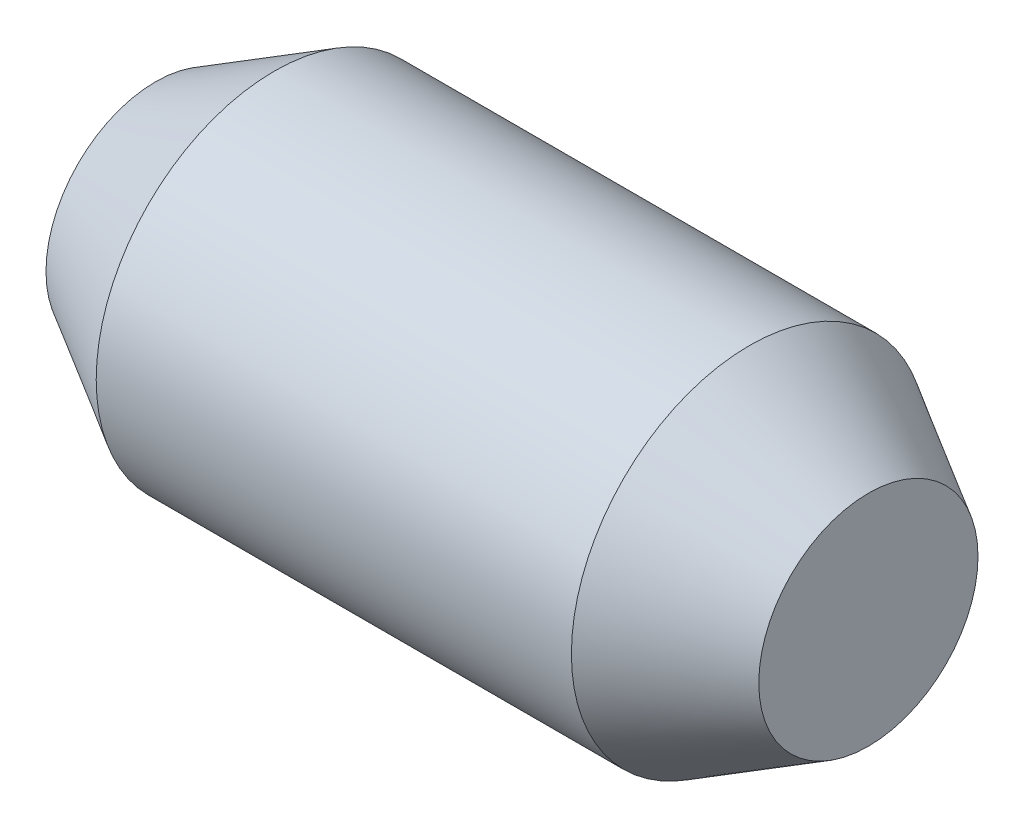
ISO-10303-21;
HEADER;
FILE_DESCRIPTION(('STEP AP214'),'2;1');
FILE_NAME('part.step','',(''),(''),'','','');
FILE_SCHEMA(('AUTOMOTIVE_DESIGN { 1 0 10303 214 1 1 1 1 }'));
ENDSEC;
DATA;
#1=APPLICATION_CONTEXT('core data for automotive mechanical design processes');
#2=APPLICATION_PROTOCOL_DEFINITION('international standard','automotive_design',2000,#1);
#3=PRODUCT_CONTEXT('',#1,'mechanical');
#4=PRODUCT('Part','Part','',(#3));
#5=PRODUCT_RELATED_PRODUCT_CATEGORY('part','',(#4));
#6=PRODUCT_DEFINITION_FORMATION('','',#4);
#7=PRODUCT_DEFINITION_CONTEXT('part definition',#1,'design');
#8=PRODUCT_DEFINITION('design','',#6,#7);
#9=PRODUCT_DEFINITION_SHAPE('','',#8);
#10=(LENGTH_UNIT() NAMED_UNIT(*) SI_UNIT(.MILLI.,.METRE.));
#11=(NAMED_UNIT(*) PLANE_ANGLE_UNIT() SI_UNIT($,.RADIAN.));
#12=(NAMED_UNIT(*) SI_UNIT($,.STERADIAN.) SOLID_ANGLE_UNIT());
#13=UNCERTAINTY_MEASURE_WITH_UNIT(LENGTH_MEASURE(1.E-05),#10,'distance_accuracy_value','');
#14=(GEOMETRIC_REPRESENTATION_CONTEXT(3) GLOBAL_UNCERTAINTY_ASSIGNED_CONTEXT((#13)) GLOBAL_UNIT_ASSIGNED_CONTEXT((#10,
#11,#12)) REPRESENTATION_CONTEXT('',''));
#15=CARTESIAN_POINT('',(0.,0.,0.));
#16=DIRECTION('',(0.,0.,1.));
#17=DIRECTION('',(1.,0.,0.));
#18=AXIS2_PLACEMENT_3D('',#15,#16,#17);
#19=CARTESIAN_POINT('',(6.,0.461324865405117,0.));
#20=DIRECTION('',(1.,0.,0.));
#21=DIRECTION('',(0.,0.,-1.));
#22=AXIS2_PLACEMENT_3D('',#19,#20,#21);
#23=PLANE('',#22);
#24=CARTESIAN_POINT('',(6.00000000019918,0.,0.));
#25=DIRECTION('',(-1.,0.,0.));
#26=DIRECTION('',(0.,0.,1.));
#27=AXIS2_PLACEMENT_3D('',#24,#25,#26);
#28=CIRCLE('',#27,0.922649731080611);
#29=CARTESIAN_POINT('',(6.00000000019918,0.,0.922649731080611));
#30=VERTEX_POINT('',#29);
#31=EDGE_CURVE('E18',#30,#30,#28,.T.);
#32=ORIENTED_EDGE('',*,*,#31,.F.);
#33=EDGE_LOOP('',(#32));
#34=FACE_BOUND('',#33,.T.);
#35=ADVANCED_FACE('F14',(#34),#23,.T.);
#36=CARTESIAN_POINT('',(0.,0.461324865405168,0.));
#37=DIRECTION('',(-1.,0.,0.));
#38=DIRECTION('',(0.,0.,1.));
#39=AXIS2_PLACEMENT_3D('',#36,#37,#38);
#40=PLANE('',#39);
#41=CARTESIAN_POINT('',(-1.13686837721616E-10,0.,0.));
#42=DIRECTION('',(1.,0.,0.));
#43=DIRECTION('',(0.,0.,-1.));
#44=AXIS2_PLACEMENT_3D('',#41,#42,#43);
#45=CIRCLE('',#44,0.922649731155042);
#46=CARTESIAN_POINT('',(-1.13686837721616E-10,0.,-0.922649731155042));
#47=VERTEX_POINT('',#46);
#48=EDGE_CURVE('E27',#47,#47,#45,.T.);
#49=ORIENTED_EDGE('',*,*,#48,.F.);
#50=EDGE_LOOP('',(#49));
#51=FACE_BOUND('',#50,.T.);
#52=ADVANCED_FACE('F39',(#51),#40,.T.);
#53=CARTESIAN_POINT('',(4.99999999976808,0.,0.));
#54=DIRECTION('',(-1.,0.,0.));
#55=DIRECTION('',(0.,0.,1.));
#56=AXIS2_PLACEMENT_3D('',#53,#54,#55);
#57=CONICAL_SURFACE('',#56,1.49999999968034,0.523598774969205);
#58=ORIENTED_EDGE('',*,*,#31,.T.);
#59=EDGE_LOOP('',(#58));
#60=FACE_BOUND('',#59,.T.);
#61=CARTESIAN_POINT('',(4.99999999999999,0.,0.));
#62=DIRECTION('',(-1.,0.,0.));
#63=DIRECTION('',(0.,1.,0.));
#64=AXIS2_PLACEMENT_3D('',#61,#62,#63);
#65=CIRCLE('',#64,1.49999999999999);
#66=CARTESIAN_POINT('',(4.99999999999999,1.49999999999997,0.));
#67=VERTEX_POINT('',#66);
#68=EDGE_CURVE('E22',#67,#67,#65,.T.);
#69=ORIENTED_EDGE('',*,*,#68,.F.);
#70=EDGE_LOOP('',(#69));
#71=FACE_BOUND('',#70,.T.);
#72=ADVANCED_FACE('F35',(#60,#71),#57,.T.);
#73=CARTESIAN_POINT('',(0.999999999976353,0.,0.));
#74=DIRECTION('',(1.,0.,0.));
#75=DIRECTION('',(0.,0.,-1.));
#76=AXIS2_PLACEMENT_3D('',#73,#74,#75);
#77=CONICAL_SURFACE('',#76,1.4999999996235,0.523598775018433);
#78=ORIENTED_EDGE('',*,*,#48,.T.);
#79=EDGE_LOOP('',(#78));
#80=FACE_BOUND('',#79,.T.);
#81=CARTESIAN_POINT('',(0.999999999999988,0.,0.));
#82=DIRECTION('',(-1.,0.,0.));
#83=DIRECTION('',(0.,1.,0.));
#84=AXIS2_PLACEMENT_3D('',#81,#82,#83);
#85=CIRCLE('',#84,1.49999999999999);
#86=CARTESIAN_POINT('',(0.999999999999988,1.49999999999997,0.));
#87=VERTEX_POINT('',#86);
#88=EDGE_CURVE('E10',#87,#87,#85,.F.);
#89=ORIENTED_EDGE('',*,*,#88,.F.);
#90=EDGE_LOOP('',(#89));
#91=FACE_BOUND('',#90,.T.);
#92=ADVANCED_FACE('F48',(#80,#91),#77,.T.);
#93=CARTESIAN_POINT('',(4.99999999999999,0.,0.));
#94=DIRECTION('',(-1.,0.,0.));
#95=DIRECTION('',(0.,0.,1.));
#96=AXIS2_PLACEMENT_3D('',#93,#94,#95);
#97=CYLINDRICAL_SURFACE('',#96,1.49999999999999);
#98=ORIENTED_EDGE('',*,*,#68,.T.);
#99=EDGE_LOOP('',(#98));
#100=FACE_BOUND('',#99,.T.);
#101=ORIENTED_EDGE('',*,*,#88,.T.);
#102=EDGE_LOOP('',(#101));
#103=FACE_BOUND('',#102,.T.);
#104=ADVANCED_FACE('F16',(#100,#103),#97,.T.);
#105=CLOSED_SHELL('',(#35,#52,#72,#92,#104));
#106=MANIFOLD_SOLID_BREP('B1',#105);
#107=ADVANCED_BREP_SHAPE_REPRESENTATION('',(#18,#106),#14);
#108=SHAPE_DEFINITION_REPRESENTATION(#9,#107);
ENDSEC;
END-ISO-10303-21;
